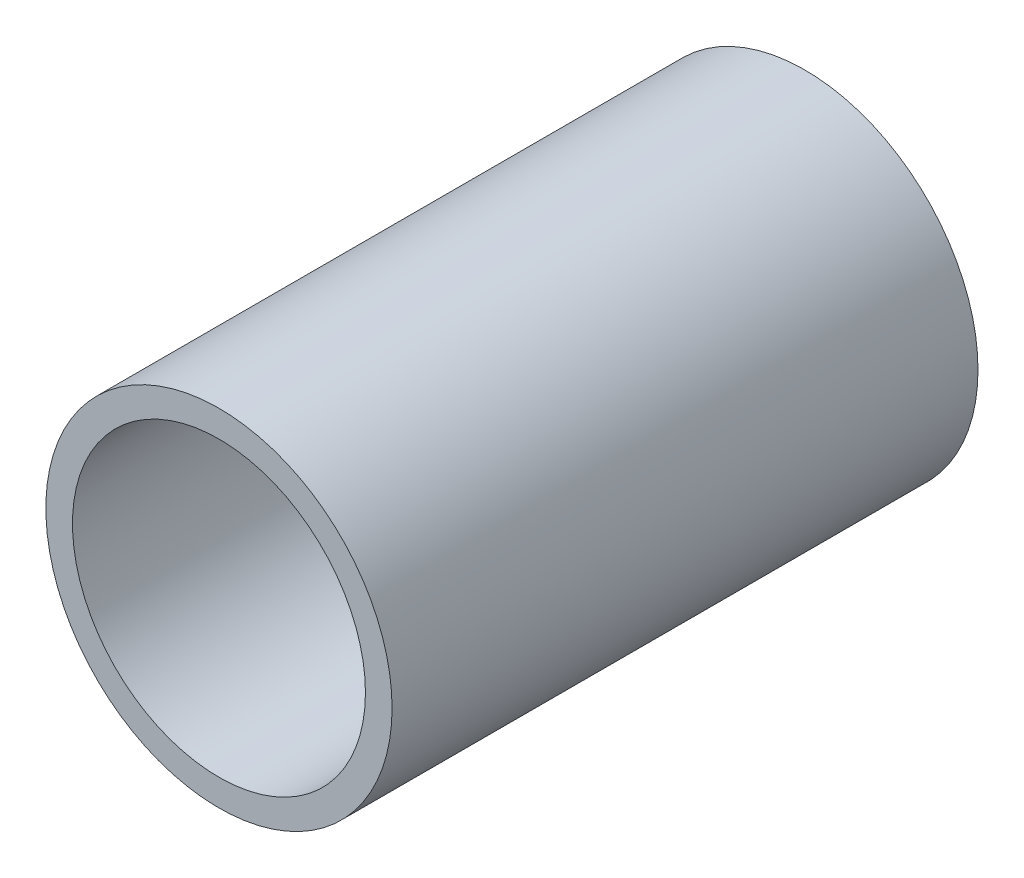
ISO-10303-21;
HEADER;
FILE_DESCRIPTION(('STEP AP214'),'2;1');
FILE_NAME('part.step','',(''),(''),'','','');
FILE_SCHEMA(('AUTOMOTIVE_DESIGN { 1 0 10303 214 1 1 1 1 }'));
ENDSEC;
DATA;
#1=APPLICATION_CONTEXT('core data for automotive mechanical design processes');
#2=APPLICATION_PROTOCOL_DEFINITION('international standard','automotive_design',2000,#1);
#3=PRODUCT_CONTEXT('',#1,'mechanical');
#4=PRODUCT('Part','Part','',(#3));
#5=PRODUCT_RELATED_PRODUCT_CATEGORY('part','',(#4));
#6=PRODUCT_DEFINITION_FORMATION('','',#4);
#7=PRODUCT_DEFINITION_CONTEXT('part definition',#1,'design');
#8=PRODUCT_DEFINITION('design','',#6,#7);
#9=PRODUCT_DEFINITION_SHAPE('','',#8);
#10=(LENGTH_UNIT() NAMED_UNIT(*) SI_UNIT(.MILLI.,.METRE.));
#11=(NAMED_UNIT(*) PLANE_ANGLE_UNIT() SI_UNIT($,.RADIAN.));
#12=(NAMED_UNIT(*) SI_UNIT($,.STERADIAN.) SOLID_ANGLE_UNIT());
#13=UNCERTAINTY_MEASURE_WITH_UNIT(LENGTH_MEASURE(1.E-05),#10,'distance_accuracy_value','');
#14=(GEOMETRIC_REPRESENTATION_CONTEXT(3) GLOBAL_UNCERTAINTY_ASSIGNED_CONTEXT((#13)) GLOBAL_UNIT_ASSIGNED_CONTEXT((#10,
#11,#12)) REPRESENTATION_CONTEXT('',''));
#15=CARTESIAN_POINT('',(0.,0.,0.));
#16=DIRECTION('',(0.,0.,1.));
#17=DIRECTION('',(1.,0.,0.));
#18=AXIS2_PLACEMENT_3D('',#15,#16,#17);
#19=CARTESIAN_POINT('',(0.,0.,11.));
#20=DIRECTION('',(0.,0.,1.));
#21=DIRECTION('',(1.,0.,0.));
#22=AXIS2_PLACEMENT_3D('',#19,#20,#21);
#23=PLANE('',#22);
#24=CARTESIAN_POINT('',(0.,0.,11.));
#25=DIRECTION('',(0.,0.,1.));
#26=DIRECTION('',(1.,0.,0.));
#27=AXIS2_PLACEMENT_3D('',#24,#25,#26);
#28=CIRCLE('',#27,3.25);
#29=CARTESIAN_POINT('',(3.25,0.,11.));
#30=VERTEX_POINT('',#29);
#31=EDGE_CURVE('E10',#30,#30,#28,.T.);
#32=ORIENTED_EDGE('',*,*,#31,.T.);
#33=EDGE_LOOP('',(#32));
#34=FACE_BOUND('',#33,.T.);
#35=CARTESIAN_POINT('',(0.,0.,11.));
#36=DIRECTION('',(0.,0.,1.));
#37=DIRECTION('',(1.,0.,0.));
#38=AXIS2_PLACEMENT_3D('',#35,#36,#37);
#39=CIRCLE('',#38,2.75);
#40=CARTESIAN_POINT('',(2.75,0.,11.));
#41=VERTEX_POINT('',#40);
#42=EDGE_CURVE('E42',#41,#41,#39,.T.);
#43=ORIENTED_EDGE('',*,*,#42,.F.);
#44=EDGE_LOOP('',(#43));
#45=FACE_BOUND('',#44,.T.);
#46=ADVANCED_FACE('F31',(#34,#45),#23,.T.);
#47=CARTESIAN_POINT('',(0.,0.,0.));
#48=DIRECTION('',(0.,0.,1.));
#49=DIRECTION('',(1.,0.,0.));
#50=AXIS2_PLACEMENT_3D('',#47,#48,#49);
#51=PLANE('',#50);
#52=CARTESIAN_POINT('',(0.,0.,0.));
#53=DIRECTION('',(0.,0.,1.));
#54=DIRECTION('',(1.,0.,0.));
#55=AXIS2_PLACEMENT_3D('',#52,#53,#54);
#56=CIRCLE('',#55,3.25);
#57=CARTESIAN_POINT('',(3.25,0.,0.));
#58=VERTEX_POINT('',#57);
#59=EDGE_CURVE('E35',#58,#58,#56,.T.);
#60=ORIENTED_EDGE('',*,*,#59,.F.);
#61=EDGE_LOOP('',(#60));
#62=FACE_BOUND('',#61,.T.);
#63=CARTESIAN_POINT('',(0.,0.,0.));
#64=DIRECTION('',(0.,0.,1.));
#65=DIRECTION('',(1.,0.,0.));
#66=AXIS2_PLACEMENT_3D('',#63,#64,#65);
#67=CIRCLE('',#66,2.75);
#68=CARTESIAN_POINT('',(2.75,0.,0.));
#69=VERTEX_POINT('',#68);
#70=EDGE_CURVE('E44',#69,#69,#67,.T.);
#71=ORIENTED_EDGE('',*,*,#70,.T.);
#72=EDGE_LOOP('',(#71));
#73=FACE_BOUND('',#72,.T.);
#74=ADVANCED_FACE('F54',(#62,#73),#51,.F.);
#75=CARTESIAN_POINT('',(0.,0.,11.));
#76=DIRECTION('',(0.,0.,-1.));
#77=DIRECTION('',(-1.,0.,0.));
#78=AXIS2_PLACEMENT_3D('',#75,#76,#77);
#79=CYLINDRICAL_SURFACE('',#78,3.25);
#80=ORIENTED_EDGE('',*,*,#31,.F.);
#81=EDGE_LOOP('',(#80));
#82=FACE_BOUND('',#81,.T.);
#83=ORIENTED_EDGE('',*,*,#59,.T.);
#84=EDGE_LOOP('',(#83));
#85=FACE_BOUND('',#84,.T.);
#86=ADVANCED_FACE('F33',(#82,#85),#79,.T.);
#87=CARTESIAN_POINT('',(0.,0.,11.));
#88=DIRECTION('',(0.,0.,-1.));
#89=DIRECTION('',(-1.,0.,0.));
#90=AXIS2_PLACEMENT_3D('',#87,#88,#89);
#91=CYLINDRICAL_SURFACE('',#90,2.75);
#92=ORIENTED_EDGE('',*,*,#42,.T.);
#93=EDGE_LOOP('',(#92));
#94=FACE_BOUND('',#93,.T.);
#95=ORIENTED_EDGE('',*,*,#70,.F.);
#96=EDGE_LOOP('',(#95));
#97=FACE_BOUND('',#96,.T.);
#98=ADVANCED_FACE('F50',(#94,#97),#91,.F.);
#99=CLOSED_SHELL('',(#46,#74,#86,#98));
#100=MANIFOLD_SOLID_BREP('B2',#99);
#101=ADVANCED_BREP_SHAPE_REPRESENTATION('',(#18,#100),#14);
#102=SHAPE_DEFINITION_REPRESENTATION(#9,#101);
ENDSEC;
END-ISO-10303-21;
